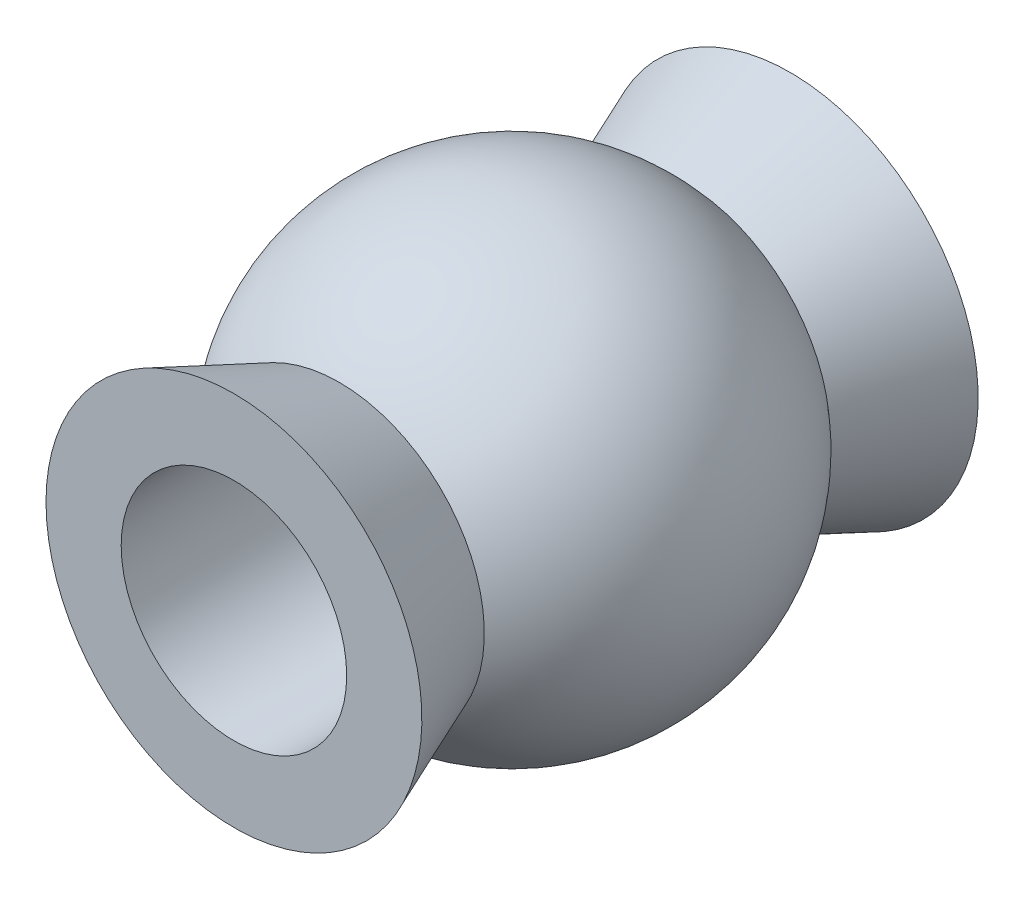
ISO-10303-21;
HEADER;
FILE_DESCRIPTION(('STEP AP214'),'2;1');
FILE_NAME('part.step','',(''),(''),'','','');
FILE_SCHEMA(('AUTOMOTIVE_DESIGN { 1 0 10303 214 1 1 1 1 }'));
ENDSEC;
DATA;
#1=APPLICATION_CONTEXT('core data for automotive mechanical design processes');
#2=APPLICATION_PROTOCOL_DEFINITION('international standard','automotive_design',2000,#1);
#3=PRODUCT_CONTEXT('',#1,'mechanical');
#4=PRODUCT('Part','Part','',(#3));
#5=PRODUCT_RELATED_PRODUCT_CATEGORY('part','',(#4));
#6=PRODUCT_DEFINITION_FORMATION('','',#4);
#7=PRODUCT_DEFINITION_CONTEXT('part definition',#1,'design');
#8=PRODUCT_DEFINITION('design','',#6,#7);
#9=PRODUCT_DEFINITION_SHAPE('','',#8);
#10=(LENGTH_UNIT() NAMED_UNIT(*) SI_UNIT(.MILLI.,.METRE.));
#11=(NAMED_UNIT(*) PLANE_ANGLE_UNIT() SI_UNIT($,.RADIAN.));
#12=(NAMED_UNIT(*) SI_UNIT($,.STERADIAN.) SOLID_ANGLE_UNIT());
#13=UNCERTAINTY_MEASURE_WITH_UNIT(LENGTH_MEASURE(1.E-05),#10,'distance_accuracy_value','');
#14=(GEOMETRIC_REPRESENTATION_CONTEXT(3) GLOBAL_UNCERTAINTY_ASSIGNED_CONTEXT((#13)) GLOBAL_UNIT_ASSIGNED_CONTEXT((#10,
#11,#12)) REPRESENTATION_CONTEXT('',''));
#15=CARTESIAN_POINT('',(0.,0.,0.));
#16=DIRECTION('',(0.,0.,1.));
#17=DIRECTION('',(1.,0.,0.));
#18=AXIS2_PLACEMENT_3D('',#15,#16,#17);
#19=CARTESIAN_POINT('',(0.,0.,0.));
#20=DIRECTION('',(0.,-1.,0.));
#21=DIRECTION('',(-1.,0.,0.));
#22=AXIS2_PLACEMENT_3D('',#19,#20,#21);
#23=SPHERICAL_SURFACE('',#22,3.);
#24=CARTESIAN_POINT('',(0.,0.,0.));
#25=DIRECTION('',(0.,0.,-1.));
#26=DIRECTION('',(0.,1.,0.));
#27=AXIS2_PLACEMENT_3D('',#24,#25,#26);
#28=SPHERICAL_SURFACE('',#27,3.);
#29=CARTESIAN_POINT('',(0.,0.,2.29807621135331));
#30=DIRECTION('',(0.,0.,-1.));
#31=DIRECTION('',(0.,1.,0.));
#32=AXIS2_PLACEMENT_3D('',#29,#30,#31);
#33=CIRCLE('',#32,1.92843089759836);
#34=CARTESIAN_POINT('',(0.,1.92843089759836,2.29807621135331));
#35=VERTEX_POINT('',#34);
#36=EDGE_CURVE('E10',#35,#35,#33,.F.);
#37=ORIENTED_EDGE('',*,*,#36,.F.);
#38=EDGE_LOOP('',(#37));
#39=FACE_BOUND('',#38,.T.);
#40=CARTESIAN_POINT('',(0.,0.,-2.29807621135331));
#41=DIRECTION('',(0.,0.,-1.));
#42=DIRECTION('',(-1.,0.,0.));
#43=AXIS2_PLACEMENT_3D('',#40,#41,#42);
#44=CIRCLE('',#43,1.92843089759836);
#45=CARTESIAN_POINT('',(-1.92843089759836,0.,-2.29807621135331));
#46=VERTEX_POINT('',#45);
#47=EDGE_CURVE('E53',#46,#46,#44,.T.);
#48=ORIENTED_EDGE('',*,*,#47,.F.);
#49=EDGE_LOOP('',(#48));
#50=FACE_BOUND('',#49,.T.);
#51=ADVANCED_FACE('F39',(#39,#50),#28,.T.);
#52=CARTESIAN_POINT('',(0.,0.,-3.));
#53=DIRECTION('',(0.,0.,1.));
#54=DIRECTION('',(1.,0.,0.));
#55=AXIS2_PLACEMENT_3D('',#52,#53,#54);
#56=CYLINDRICAL_SURFACE('',#55,1.5);
#57=CARTESIAN_POINT('',(0.,0.,3.7));
#58=DIRECTION('',(0.,0.,-1.));
#59=DIRECTION('',(-1.,0.,0.));
#60=AXIS2_PLACEMENT_3D('',#57,#58,#59);
#61=CIRCLE('',#60,1.5);
#62=CARTESIAN_POINT('',(1.5,0.,3.7));
#63=VERTEX_POINT('',#62);
#64=EDGE_CURVE('E49',#63,#63,#61,.T.);
#65=CARTESIAN_POINT('',(0.,0.,-3.7));
#66=DIRECTION('',(0.,0.,-1.));
#67=DIRECTION('',(-1.,0.,0.));
#68=AXIS2_PLACEMENT_3D('',#65,#66,#67);
#69=CIRCLE('',#68,1.5);
#70=CARTESIAN_POINT('',(1.5,0.,-3.7));
#71=VERTEX_POINT('',#70);
#72=EDGE_CURVE('E61',#71,#71,#69,.T.);
#73=CARTESIAN_POINT('',(1.5,0.,3.7));
#74=CARTESIAN_POINT('',(1.5,0.,3.62291666666667));
#75=CARTESIAN_POINT('',(1.5,0.,3.54583333333333));
#76=CARTESIAN_POINT('',(1.5,0.,3.39166666666667));
#77=CARTESIAN_POINT('',(1.5,0.,3.31458333333333));
#78=CARTESIAN_POINT('',(1.5,0.,3.16041666666667));
#79=CARTESIAN_POINT('',(1.5,0.,3.08333333333333));
#80=CARTESIAN_POINT('',(1.5,0.,2.92916666666667));
#81=CARTESIAN_POINT('',(1.5,0.,2.85208333333333));
#82=CARTESIAN_POINT('',(1.5,0.,2.69791666666667));
#83=CARTESIAN_POINT('',(1.5,0.,2.62083333333333));
#84=CARTESIAN_POINT('',(1.5,0.,2.46666666666667));
#85=CARTESIAN_POINT('',(1.5,0.,2.38958333333333));
#86=CARTESIAN_POINT('',(1.5,0.,2.23541666666667));
#87=CARTESIAN_POINT('',(1.5,0.,2.15833333333333));
#88=CARTESIAN_POINT('',(1.5,0.,2.00416666666667));
#89=CARTESIAN_POINT('',(1.5,0.,1.92708333333333));
#90=CARTESIAN_POINT('',(1.5,0.,1.77291666666667));
#91=CARTESIAN_POINT('',(1.5,0.,1.69583333333333));
#92=CARTESIAN_POINT('',(1.5,0.,1.54166666666667));
#93=CARTESIAN_POINT('',(1.5,0.,1.46458333333333));
#94=CARTESIAN_POINT('',(1.5,0.,1.31041666666667));
#95=CARTESIAN_POINT('',(1.5,0.,1.23333333333333));
#96=CARTESIAN_POINT('',(1.5,0.,1.07916666666667));
#97=CARTESIAN_POINT('',(1.5,0.,1.00208333333333));
#98=CARTESIAN_POINT('',(1.5,0.,0.847916666666667));
#99=CARTESIAN_POINT('',(1.5,0.,0.770833333333334));
#100=CARTESIAN_POINT('',(1.5,0.,0.616666666666667));
#101=CARTESIAN_POINT('',(1.5,0.,0.539583333333334));
#102=CARTESIAN_POINT('',(1.5,0.,0.385416666666667));
#103=CARTESIAN_POINT('',(1.5,0.,0.308333333333334));
#104=CARTESIAN_POINT('',(1.5,0.,0.154166666666667));
#105=CARTESIAN_POINT('',(1.5,0.,0.0770833333333338));
#106=CARTESIAN_POINT('',(1.5,0.,-0.0770833333333329));
#107=CARTESIAN_POINT('',(1.5,0.,-0.154166666666666));
#108=CARTESIAN_POINT('',(1.5,0.,-0.308333333333333));
#109=CARTESIAN_POINT('',(1.5,0.,-0.385416666666666));
#110=CARTESIAN_POINT('',(1.5,0.,-0.539583333333333));
#111=CARTESIAN_POINT('',(1.5,0.,-0.616666666666666));
#112=CARTESIAN_POINT('',(1.5,0.,-0.770833333333333));
#113=CARTESIAN_POINT('',(1.5,0.,-0.847916666666666));
#114=CARTESIAN_POINT('',(1.5,0.,-1.00208333333333));
#115=CARTESIAN_POINT('',(1.5,0.,-1.07916666666667));
#116=CARTESIAN_POINT('',(1.5,0.,-1.23333333333333));
#117=CARTESIAN_POINT('',(1.5,0.,-1.31041666666667));
#118=CARTESIAN_POINT('',(1.5,0.,-1.46458333333333));
#119=CARTESIAN_POINT('',(1.5,0.,-1.54166666666667));
#120=CARTESIAN_POINT('',(1.5,0.,-1.69583333333333));
#121=CARTESIAN_POINT('',(1.5,0.,-1.77291666666667));
#122=CARTESIAN_POINT('',(1.5,0.,-1.92708333333333));
#123=CARTESIAN_POINT('',(1.5,0.,-2.00416666666667));
#124=CARTESIAN_POINT('',(1.5,0.,-2.15833333333333));
#125=CARTESIAN_POINT('',(1.5,0.,-2.23541666666667));
#126=CARTESIAN_POINT('',(1.5,0.,-2.38958333333333));
#127=CARTESIAN_POINT('',(1.5,0.,-2.46666666666667));
#128=CARTESIAN_POINT('',(1.5,0.,-2.62083333333333));
#129=CARTESIAN_POINT('',(1.5,0.,-2.69791666666667));
#130=CARTESIAN_POINT('',(1.5,0.,-2.85208333333333));
#131=CARTESIAN_POINT('',(1.5,0.,-2.92916666666667));
#132=CARTESIAN_POINT('',(1.5,0.,-3.08333333333333));
#133=CARTESIAN_POINT('',(1.5,0.,-3.16041666666667));
#134=CARTESIAN_POINT('',(1.5,0.,-3.31458333333333));
#135=CARTESIAN_POINT('',(1.5,0.,-3.39166666666667));
#136=CARTESIAN_POINT('',(1.5,0.,-3.54583333333333));
#137=CARTESIAN_POINT('',(1.5,0.,-3.62291666666667));
#138=CARTESIAN_POINT('',(1.5,0.,-3.7));
#139=B_SPLINE_CURVE_WITH_KNOTS('',3,(#73,#74,#75,#76,#77,#78,#79,#80,#81,#82,#83,#84,#85,#86,
#87,#88,#89,#90,#91,#92,#93,#94,#95,#96,#97,#98,#99,#100,#101,#102,#103,#104,#105,#106,#107,
#108,#109,#110,#111,#112,#113,#114,#115,#116,#117,#118,#119,#120,#121,#122,#123,#124,#125,#126,
#127,#128,#129,#130,#131,#132,#133,#134,#135,#136,#137,#138),.UNSPECIFIED.,.F.,.F.,(4,2,2,2,2,2,
2,2,2,2,2,2,2,2,2,2,2,2,2,2,2,2,2,2,2,2,2,2,2,2,2,2,4),(0.,0.23125,0.4625,0.69375,0.925,1.15625,
1.3875,1.61875,1.85,2.08125,2.3125,2.54375,2.775,3.00625,3.2375,3.46875,3.7,3.93125,4.1625,
4.39375,4.625,4.85625,5.0875,5.31875,5.55,5.78125,6.0125,6.24375,6.475,6.70625,6.9375,7.16875,
7.4),.UNSPECIFIED.);
#140=EDGE_CURVE('BSEAM65',#63,#71,#139,.T.);
#141=ORIENTED_EDGE('',*,*,#64,.F.);
#142=ORIENTED_EDGE('',*,*,#72,.T.);
#143=ORIENTED_EDGE('',*,*,#140,.T.);
#144=ORIENTED_EDGE('',*,*,#140,.F.);
#145=EDGE_LOOP('',(#141,#143,#142,#144));
#146=FACE_BOUND('',#145,.T.);
#147=ADVANCED_FACE('F65',(#146),#56,.F.);
#148=CARTESIAN_POINT('',(0.,0.,3.7));
#149=DIRECTION('',(0.,0.,1.));
#150=DIRECTION('',(1.,0.,0.));
#151=AXIS2_PLACEMENT_3D('',#148,#149,#150);
#152=CONICAL_SURFACE('',#151,2.5,0.387129553071859);
#153=ORIENTED_EDGE('',*,*,#36,.T.);
#154=EDGE_LOOP('',(#153));
#155=FACE_BOUND('',#154,.T.);
#156=CARTESIAN_POINT('',(0.,0.,3.7));
#157=DIRECTION('',(0.,0.,-1.));
#158=DIRECTION('',(-1.,0.,0.));
#159=AXIS2_PLACEMENT_3D('',#156,#157,#158);
#160=CIRCLE('',#159,2.5);
#161=CARTESIAN_POINT('',(-2.5,0.,3.7));
#162=VERTEX_POINT('',#161);
#163=EDGE_CURVE('E45',#162,#162,#160,.T.);
#164=ORIENTED_EDGE('',*,*,#163,.T.);
#165=EDGE_LOOP('',(#164));
#166=FACE_BOUND('',#165,.T.);
#167=ADVANCED_FACE('F84',(#155,#166),#152,.T.);
#168=CARTESIAN_POINT('',(0.,0.,3.7));
#169=DIRECTION('',(0.,0.,-1.));
#170=DIRECTION('',(-1.,0.,0.));
#171=AXIS2_PLACEMENT_3D('',#168,#169,#170);
#172=PLANE('',#171);
#173=ORIENTED_EDGE('',*,*,#163,.F.);
#174=EDGE_LOOP('',(#173));
#175=FACE_BOUND('',#174,.T.);
#176=ORIENTED_EDGE('',*,*,#64,.T.);
#177=EDGE_LOOP('',(#176));
#178=FACE_BOUND('',#177,.T.);
#179=ADVANCED_FACE('F75',(#175,#178),#172,.F.);
#180=CARTESIAN_POINT('',(0.,0.,-3.7));
#181=DIRECTION('',(0.,0.,-1.));
#182=DIRECTION('',(1.,0.,0.));
#183=AXIS2_PLACEMENT_3D('',#180,#181,#182);
#184=CONICAL_SURFACE('',#183,2.5,0.387129553071859);
#185=ORIENTED_EDGE('',*,*,#47,.T.);
#186=EDGE_LOOP('',(#185));
#187=FACE_BOUND('',#186,.T.);
#188=CARTESIAN_POINT('',(0.,0.,-3.7));
#189=DIRECTION('',(0.,0.,-1.));
#190=DIRECTION('',(-1.,0.,0.));
#191=AXIS2_PLACEMENT_3D('',#188,#189,#190);
#192=CIRCLE('',#191,2.5);
#193=CARTESIAN_POINT('',(-2.5,0.,-3.7));
#194=VERTEX_POINT('',#193);
#195=EDGE_CURVE('E58',#194,#194,#192,.T.);
#196=ORIENTED_EDGE('',*,*,#195,.F.);
#197=EDGE_LOOP('',(#196));
#198=FACE_BOUND('',#197,.T.);
#199=ADVANCED_FACE('F69',(#187,#198),#184,.T.);
#200=CARTESIAN_POINT('',(0.,0.,-3.7));
#201=DIRECTION('',(0.,0.,1.));
#202=DIRECTION('',(-1.,0.,0.));
#203=AXIS2_PLACEMENT_3D('',#200,#201,#202);
#204=PLANE('',#203);
#205=ORIENTED_EDGE('',*,*,#195,.T.);
#206=EDGE_LOOP('',(#205));
#207=FACE_BOUND('',#206,.T.);
#208=ORIENTED_EDGE('',*,*,#72,.F.);
#209=EDGE_LOOP('',(#208));
#210=FACE_BOUND('',#209,.T.);
#211=ADVANCED_FACE('F67',(#207,#210),#204,.F.);
#212=CLOSED_SHELL('',(#51,#147,#167,#179,#199,#211));
#213=MANIFOLD_SOLID_BREP('B2',#212);
#214=ADVANCED_BREP_SHAPE_REPRESENTATION('',(#18,#213),#14);
#215=SHAPE_DEFINITION_REPRESENTATION(#9,#214);
ENDSEC;
END-ISO-10303-21;
